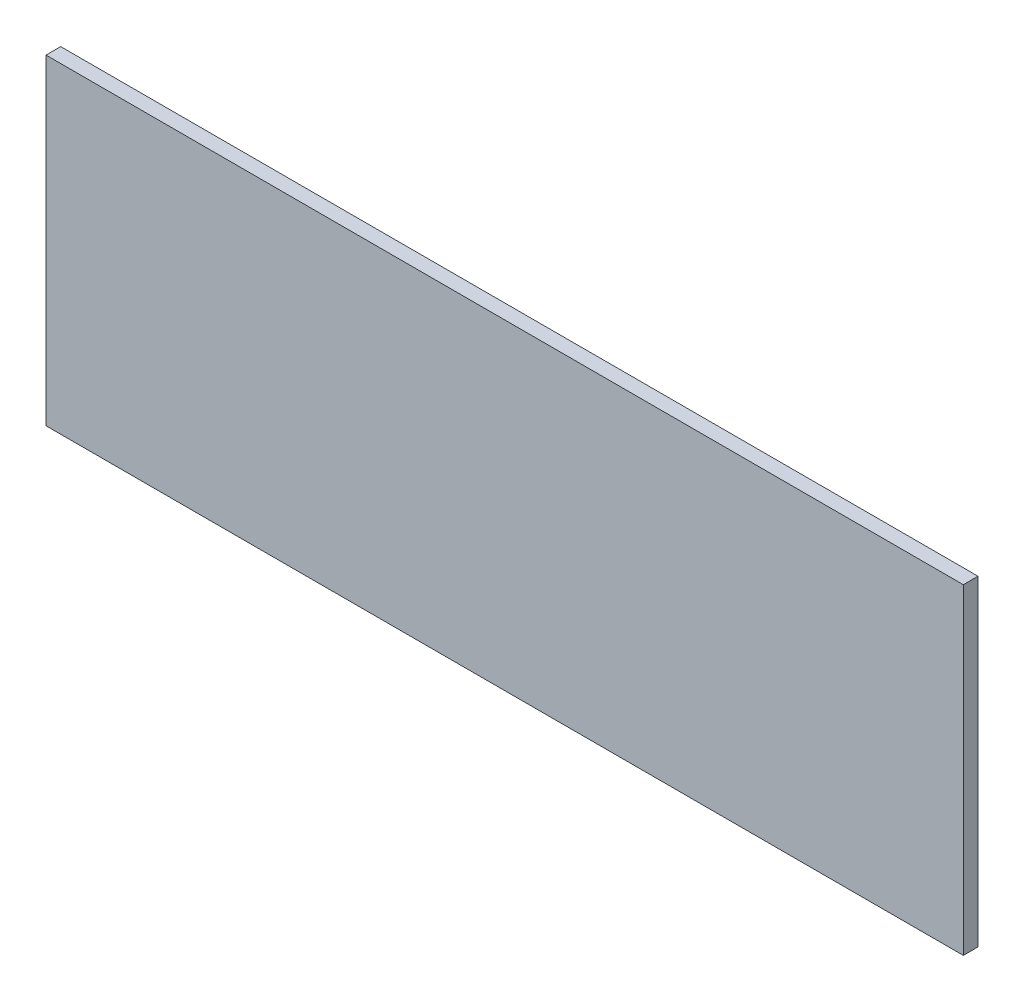
ISO-10303-21;
HEADER;
FILE_DESCRIPTION(('STEP AP214'),'2;1');
FILE_NAME('part.step','',(''),(''),'','','');
FILE_SCHEMA(('AUTOMOTIVE_DESIGN { 1 0 10303 214 1 1 1 1 }'));
ENDSEC;
DATA;
#1=APPLICATION_CONTEXT('core data for automotive mechanical design processes');
#2=APPLICATION_PROTOCOL_DEFINITION('international standard','automotive_design',2000,#1);
#3=PRODUCT_CONTEXT('',#1,'mechanical');
#4=PRODUCT('Part','Part','',(#3));
#5=PRODUCT_RELATED_PRODUCT_CATEGORY('part','',(#4));
#6=PRODUCT_DEFINITION_FORMATION('','',#4);
#7=PRODUCT_DEFINITION_CONTEXT('part definition',#1,'design');
#8=PRODUCT_DEFINITION('design','',#6,#7);
#9=PRODUCT_DEFINITION_SHAPE('','',#8);
#10=(LENGTH_UNIT() NAMED_UNIT(*) SI_UNIT(.MILLI.,.METRE.));
#11=(NAMED_UNIT(*) PLANE_ANGLE_UNIT() SI_UNIT($,.RADIAN.));
#12=(NAMED_UNIT(*) SI_UNIT($,.STERADIAN.) SOLID_ANGLE_UNIT());
#13=UNCERTAINTY_MEASURE_WITH_UNIT(LENGTH_MEASURE(1.E-05),#10,'distance_accuracy_value','');
#14=(GEOMETRIC_REPRESENTATION_CONTEXT(3) GLOBAL_UNCERTAINTY_ASSIGNED_CONTEXT((#13)) GLOBAL_UNIT_ASSIGNED_CONTEXT((#10,
#11,#12)) REPRESENTATION_CONTEXT('',''));
#15=CARTESIAN_POINT('',(0.,0.,0.));
#16=DIRECTION('',(0.,0.,1.));
#17=DIRECTION('',(1.,0.,0.));
#18=AXIS2_PLACEMENT_3D('',#15,#16,#17);
#19=CARTESIAN_POINT('',(-46.8719358672992,3.20477089033923,0.8));
#20=DIRECTION('',(1.,0.,0.));
#21=DIRECTION('',(0.,0.,-1.));
#22=AXIS2_PLACEMENT_3D('',#19,#20,#21);
#23=PLANE('',#22);
#24=DIRECTION('',(0.,-1.,0.));
#25=VECTOR('',#24,1.);
#26=CARTESIAN_POINT('',(-46.8719358672992,3.20477089033923,0.));
#27=LINE('',#26,#25);
#28=CARTESIAN_POINT('',(-46.8719358672992,3.20477089033923,0.));
#29=VERTEX_POINT('',#28);
#30=CARTESIAN_POINT('',(-46.8719358672992,-14.2952291096608,0.));
#31=VERTEX_POINT('',#30);
#32=EDGE_CURVE('E99',#29,#31,#27,.T.);
#33=ORIENTED_EDGE('',*,*,#32,.T.);
#34=DIRECTION('',(0.,0.,-1.));
#35=VECTOR('',#34,1.);
#36=CARTESIAN_POINT('',(-46.8719358672992,-14.2952291096608,0.8));
#37=LINE('',#36,#35);
#38=CARTESIAN_POINT('',(-46.8719358672992,-14.2952291096608,0.8));
#39=VERTEX_POINT('',#38);
#40=EDGE_CURVE('E11',#39,#31,#37,.T.);
#41=ORIENTED_EDGE('',*,*,#40,.F.);
#42=DIRECTION('',(0.,-1.,0.));
#43=VECTOR('',#42,1.);
#44=CARTESIAN_POINT('',(-46.8719358672992,3.20477089033923,0.8));
#45=LINE('',#44,#43);
#46=CARTESIAN_POINT('',(-46.8719358672992,3.20477089033923,0.8));
#47=VERTEX_POINT('',#46);
#48=EDGE_CURVE('E87',#47,#39,#45,.T.);
#49=ORIENTED_EDGE('',*,*,#48,.F.);
#50=DIRECTION('',(0.,0.,-1.));
#51=VECTOR('',#50,1.);
#52=CARTESIAN_POINT('',(-46.8719358672992,3.20477089033923,0.8));
#53=LINE('',#52,#51);
#54=EDGE_CURVE('E95',#47,#29,#53,.T.);
#55=ORIENTED_EDGE('',*,*,#54,.T.);
#56=EDGE_LOOP('',(#33,#41,#49,#55));
#57=FACE_BOUND('',#56,.T.);
#58=ADVANCED_FACE('F36',(#57),#23,.F.);
#59=CARTESIAN_POINT('',(-46.8719358672992,-14.2952291096608,0.8));
#60=DIRECTION('',(0.,1.,0.));
#61=DIRECTION('',(0.,0.,1.));
#62=AXIS2_PLACEMENT_3D('',#59,#60,#61);
#63=PLANE('',#62);
#64=DIRECTION('',(1.,0.,0.));
#65=VECTOR('',#64,1.);
#66=CARTESIAN_POINT('',(-46.8719358672992,-14.2952291096608,0.));
#67=LINE('',#66,#65);
#68=CARTESIAN_POINT('',(3.1280641327008,-14.2952291096608,0.));
#69=VERTEX_POINT('',#68);
#70=EDGE_CURVE('E91',#31,#69,#67,.T.);
#71=ORIENTED_EDGE('',*,*,#70,.T.);
#72=DIRECTION('',(0.,0.,-1.));
#73=VECTOR('',#72,1.);
#74=CARTESIAN_POINT('',(3.1280641327008,-14.2952291096608,0.8));
#75=LINE('',#74,#73);
#76=CARTESIAN_POINT('',(3.1280641327008,-14.2952291096608,0.8));
#77=VERTEX_POINT('',#76);
#78=EDGE_CURVE('E44',#77,#69,#75,.T.);
#79=ORIENTED_EDGE('',*,*,#78,.F.);
#80=DIRECTION('',(1.,0.,0.));
#81=VECTOR('',#80,1.);
#82=CARTESIAN_POINT('',(-46.8719358672992,-14.2952291096608,0.8));
#83=LINE('',#82,#81);
#84=EDGE_CURVE('E82',#39,#77,#83,.T.);
#85=ORIENTED_EDGE('',*,*,#84,.F.);
#86=ORIENTED_EDGE('',*,*,#40,.T.);
#87=EDGE_LOOP('',(#71,#79,#85,#86));
#88=FACE_BOUND('',#87,.T.);
#89=ADVANCED_FACE('F90',(#88),#63,.F.);
#90=CARTESIAN_POINT('',(3.1280641327008,3.20477089033923,0.8));
#91=DIRECTION('',(-1.,0.,0.));
#92=DIRECTION('',(0.,0.,1.));
#93=AXIS2_PLACEMENT_3D('',#90,#91,#92);
#94=PLANE('',#93);
#95=DIRECTION('',(0.,1.,0.));
#96=VECTOR('',#95,1.);
#97=CARTESIAN_POINT('',(3.1280641327008,3.20477089033923,0.));
#98=LINE('',#97,#96);
#99=CARTESIAN_POINT('',(3.1280641327008,3.20477089033923,0.));
#100=VERTEX_POINT('',#99);
#101=EDGE_CURVE('E69',#69,#100,#98,.T.);
#102=ORIENTED_EDGE('',*,*,#101,.T.);
#103=DIRECTION('',(0.,0.,-1.));
#104=VECTOR('',#103,1.);
#105=CARTESIAN_POINT('',(3.1280641327008,3.20477089033923,0.8));
#106=LINE('',#105,#104);
#107=CARTESIAN_POINT('',(3.1280641327008,3.20477089033923,0.8));
#108=VERTEX_POINT('',#107);
#109=EDGE_CURVE('E92',#108,#100,#106,.T.);
#110=ORIENTED_EDGE('',*,*,#109,.F.);
#111=DIRECTION('',(0.,1.,0.));
#112=VECTOR('',#111,1.);
#113=CARTESIAN_POINT('',(3.1280641327008,3.20477089033923,0.8));
#114=LINE('',#113,#112);
#115=EDGE_CURVE('E85',#77,#108,#114,.T.);
#116=ORIENTED_EDGE('',*,*,#115,.F.);
#117=ORIENTED_EDGE('',*,*,#78,.T.);
#118=EDGE_LOOP('',(#102,#110,#116,#117));
#119=FACE_BOUND('',#118,.T.);
#120=ADVANCED_FACE('F93',(#119),#94,.F.);
#121=CARTESIAN_POINT('',(-46.8719358672992,3.20477089033923,0.8));
#122=DIRECTION('',(0.,-1.,0.));
#123=DIRECTION('',(1.,0.,0.));
#124=AXIS2_PLACEMENT_3D('',#121,#122,#123);
#125=PLANE('',#124);
#126=DIRECTION('',(-1.,0.,0.));
#127=VECTOR('',#126,1.);
#128=CARTESIAN_POINT('',(-46.8719358672992,3.20477089033923,0.));
#129=LINE('',#128,#127);
#130=EDGE_CURVE('E75',#100,#29,#129,.T.);
#131=ORIENTED_EDGE('',*,*,#130,.T.);
#132=ORIENTED_EDGE('',*,*,#54,.F.);
#133=DIRECTION('',(-1.,0.,0.));
#134=VECTOR('',#133,1.);
#135=CARTESIAN_POINT('',(-46.8719358672992,3.20477089033923,0.8));
#136=LINE('',#135,#134);
#137=EDGE_CURVE('E52',#108,#47,#136,.T.);
#138=ORIENTED_EDGE('',*,*,#137,.F.);
#139=ORIENTED_EDGE('',*,*,#109,.T.);
#140=EDGE_LOOP('',(#131,#132,#138,#139));
#141=FACE_BOUND('',#140,.T.);
#142=ADVANCED_FACE('F106',(#141),#125,.F.);
#143=CARTESIAN_POINT('',(0.,0.,0.8));
#144=DIRECTION('',(0.,0.,1.));
#145=DIRECTION('',(1.,0.,0.));
#146=AXIS2_PLACEMENT_3D('',#143,#144,#145);
#147=PLANE('',#146);
#148=ORIENTED_EDGE('',*,*,#48,.T.);
#149=ORIENTED_EDGE('',*,*,#84,.T.);
#150=ORIENTED_EDGE('',*,*,#115,.T.);
#151=ORIENTED_EDGE('',*,*,#137,.T.);
#152=EDGE_LOOP('',(#148,#149,#150,#151));
#153=FACE_BOUND('',#152,.T.);
#154=ADVANCED_FACE('F83',(#153),#147,.T.);
#155=CARTESIAN_POINT('',(0.,0.,0.));
#156=DIRECTION('',(0.,0.,1.));
#157=DIRECTION('',(1.,0.,0.));
#158=AXIS2_PLACEMENT_3D('',#155,#156,#157);
#159=PLANE('',#158);
#160=ORIENTED_EDGE('',*,*,#32,.F.);
#161=ORIENTED_EDGE('',*,*,#130,.F.);
#162=ORIENTED_EDGE('',*,*,#101,.F.);
#163=ORIENTED_EDGE('',*,*,#70,.F.);
#164=EDGE_LOOP('',(#160,#161,#162,#163));
#165=FACE_BOUND('',#164,.T.);
#166=ADVANCED_FACE('F109',(#165),#159,.F.);
#167=CLOSED_SHELL('',(#58,#89,#120,#142,#154,#166));
#168=MANIFOLD_SOLID_BREP('B2',#167);
#169=ADVANCED_BREP_SHAPE_REPRESENTATION('',(#18,#168),#14);
#170=SHAPE_DEFINITION_REPRESENTATION(#9,#169);
ENDSEC;
END-ISO-10303-21;
